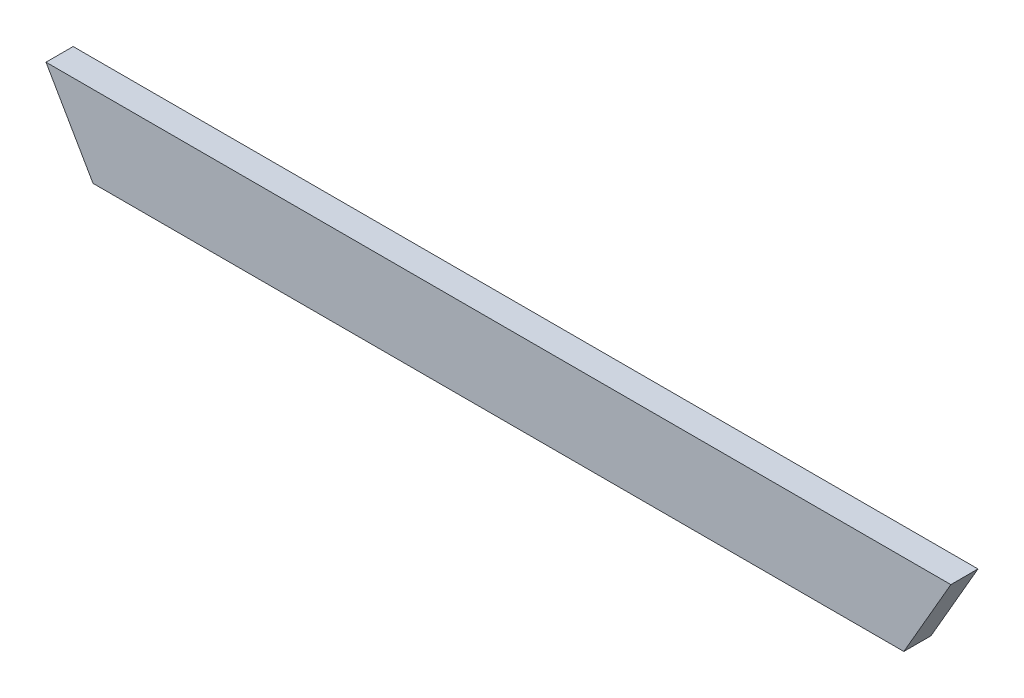
ISO-10303-21;
HEADER;
FILE_DESCRIPTION(('STEP AP214'),'2;1');
FILE_NAME('part.step','',(''),(''),'','','');
FILE_SCHEMA(('AUTOMOTIVE_DESIGN { 1 0 10303 214 1 1 1 1 }'));
ENDSEC;
DATA;
#1=APPLICATION_CONTEXT('core data for automotive mechanical design processes');
#2=APPLICATION_PROTOCOL_DEFINITION('international standard','automotive_design',2000,#1);
#3=PRODUCT_CONTEXT('',#1,'mechanical');
#4=PRODUCT('Part','Part','',(#3));
#5=PRODUCT_RELATED_PRODUCT_CATEGORY('part','',(#4));
#6=PRODUCT_DEFINITION_FORMATION('','',#4);
#7=PRODUCT_DEFINITION_CONTEXT('part definition',#1,'design');
#8=PRODUCT_DEFINITION('design','',#6,#7);
#9=PRODUCT_DEFINITION_SHAPE('','',#8);
#10=(LENGTH_UNIT() NAMED_UNIT(*) SI_UNIT(.MILLI.,.METRE.));
#11=(NAMED_UNIT(*) PLANE_ANGLE_UNIT() SI_UNIT($,.RADIAN.));
#12=(NAMED_UNIT(*) SI_UNIT($,.STERADIAN.) SOLID_ANGLE_UNIT());
#13=UNCERTAINTY_MEASURE_WITH_UNIT(LENGTH_MEASURE(1.E-05),#10,'distance_accuracy_value','');
#14=(GEOMETRIC_REPRESENTATION_CONTEXT(3) GLOBAL_UNCERTAINTY_ASSIGNED_CONTEXT((#13)) GLOBAL_UNIT_ASSIGNED_CONTEXT((#10,
#11,#12)) REPRESENTATION_CONTEXT('',''));
#15=CARTESIAN_POINT('',(0.,0.,0.));
#16=DIRECTION('',(0.,0.,1.));
#17=DIRECTION('',(1.,0.,0.));
#18=AXIS2_PLACEMENT_3D('',#15,#16,#17);
#19=CARTESIAN_POINT('',(-199.02232370725,39.1095985267382,15.));
#20=DIRECTION('',(0.866025403784439,0.499999999999999,0.));
#21=DIRECTION('',(-0.499999999999999,0.866025403784439,0.));
#22=AXIS2_PLACEMENT_3D('',#19,#20,#21);
#23=PLANE('',#22);
#24=DIRECTION('',(0.499999999999999,-0.86602540378444,0.));
#25=VECTOR('',#24,1.);
#26=CARTESIAN_POINT('',(-199.02232370725,39.1095985267382,0.));
#27=LINE('',#26,#25);
#28=CARTESIAN_POINT('',(-225.003085820783,84.1095985267383,0.));
#29=VERTEX_POINT('',#28);
#30=CARTESIAN_POINT('',(-199.02232370725,39.1095985267382,0.));
#31=VERTEX_POINT('',#30);
#32=EDGE_CURVE('E96',#29,#31,#27,.T.);
#33=ORIENTED_EDGE('',*,*,#32,.T.);
#34=DIRECTION('',(0.,0.,-1.));
#35=VECTOR('',#34,1.);
#36=CARTESIAN_POINT('',(-199.02232370725,39.1095985267382,15.));
#37=LINE('',#36,#35);
#38=CARTESIAN_POINT('',(-199.02232370725,39.1095985267382,15.));
#39=VERTEX_POINT('',#38);
#40=EDGE_CURVE('E11',#39,#31,#37,.T.);
#41=ORIENTED_EDGE('',*,*,#40,.F.);
#42=DIRECTION('',(0.499999999999999,-0.86602540378444,0.));
#43=VECTOR('',#42,1.);
#44=CARTESIAN_POINT('',(-199.02232370725,39.1095985267382,15.));
#45=LINE('',#44,#43);
#46=CARTESIAN_POINT('',(-225.003085820783,84.1095985267383,15.));
#47=VERTEX_POINT('',#46);
#48=EDGE_CURVE('E84',#47,#39,#45,.T.);
#49=ORIENTED_EDGE('',*,*,#48,.F.);
#50=DIRECTION('',(0.,0.,-1.));
#51=VECTOR('',#50,1.);
#52=CARTESIAN_POINT('',(-225.003085820783,84.1095985267383,15.));
#53=LINE('',#52,#51);
#54=EDGE_CURVE('E92',#47,#29,#53,.T.);
#55=ORIENTED_EDGE('',*,*,#54,.T.);
#56=EDGE_LOOP('',(#33,#41,#49,#55));
#57=FACE_BOUND('',#56,.T.);
#58=ADVANCED_FACE('F33',(#57),#23,.F.);
#59=CARTESIAN_POINT('',(249.016152065684,39.1095985267383,15.));
#60=DIRECTION('',(0.,1.,0.));
#61=DIRECTION('',(-1.,0.,0.));
#62=AXIS2_PLACEMENT_3D('',#59,#60,#61);
#63=PLANE('',#62);
#64=DIRECTION('',(1.,0.,0.));
#65=VECTOR('',#64,1.);
#66=CARTESIAN_POINT('',(249.016152065684,39.1095985267383,0.));
#67=LINE('',#66,#65);
#68=CARTESIAN_POINT('',(249.016152065684,39.1095985267383,0.));
#69=VERTEX_POINT('',#68);
#70=EDGE_CURVE('E88',#31,#69,#67,.T.);
#71=ORIENTED_EDGE('',*,*,#70,.T.);
#72=DIRECTION('',(0.,0.,-1.));
#73=VECTOR('',#72,1.);
#74=CARTESIAN_POINT('',(249.016152065684,39.1095985267383,15.));
#75=LINE('',#74,#73);
#76=CARTESIAN_POINT('',(249.016152065684,39.1095985267383,15.));
#77=VERTEX_POINT('',#76);
#78=EDGE_CURVE('E41',#77,#69,#75,.T.);
#79=ORIENTED_EDGE('',*,*,#78,.F.);
#80=DIRECTION('',(1.,0.,0.));
#81=VECTOR('',#80,1.);
#82=CARTESIAN_POINT('',(249.016152065684,39.1095985267383,15.));
#83=LINE('',#82,#81);
#84=EDGE_CURVE('E79',#39,#77,#83,.T.);
#85=ORIENTED_EDGE('',*,*,#84,.F.);
#86=ORIENTED_EDGE('',*,*,#40,.T.);
#87=EDGE_LOOP('',(#71,#79,#85,#86));
#88=FACE_BOUND('',#87,.T.);
#89=ADVANCED_FACE('F87',(#88),#63,.F.);
#90=CARTESIAN_POINT('',(274.996914179217,84.1095985267383,15.));
#91=DIRECTION('',(-0.866025403784438,0.5,0.));
#92=DIRECTION('',(-0.5,-0.866025403784439,0.));
#93=AXIS2_PLACEMENT_3D('',#90,#91,#92);
#94=PLANE('',#93);
#95=DIRECTION('',(0.5,0.866025403784438,0.));
#96=VECTOR('',#95,1.);
#97=CARTESIAN_POINT('',(274.996914179217,84.1095985267383,0.));
#98=LINE('',#97,#96);
#99=CARTESIAN_POINT('',(274.996914179217,84.1095985267383,0.));
#100=VERTEX_POINT('',#99);
#101=EDGE_CURVE('E66',#69,#100,#98,.T.);
#102=ORIENTED_EDGE('',*,*,#101,.T.);
#103=DIRECTION('',(0.,0.,-1.));
#104=VECTOR('',#103,1.);
#105=CARTESIAN_POINT('',(274.996914179217,84.1095985267383,15.));
#106=LINE('',#105,#104);
#107=CARTESIAN_POINT('',(274.996914179217,84.1095985267383,15.));
#108=VERTEX_POINT('',#107);
#109=EDGE_CURVE('E89',#108,#100,#106,.T.);
#110=ORIENTED_EDGE('',*,*,#109,.F.);
#111=DIRECTION('',(0.5,0.866025403784438,0.));
#112=VECTOR('',#111,1.);
#113=CARTESIAN_POINT('',(274.996914179217,84.1095985267383,15.));
#114=LINE('',#113,#112);
#115=EDGE_CURVE('E82',#77,#108,#114,.T.);
#116=ORIENTED_EDGE('',*,*,#115,.F.);
#117=ORIENTED_EDGE('',*,*,#78,.T.);
#118=EDGE_LOOP('',(#102,#110,#116,#117));
#119=FACE_BOUND('',#118,.T.);
#120=ADVANCED_FACE('F90',(#119),#94,.F.);
#121=CARTESIAN_POINT('',(-225.003085820783,84.1095985267383,15.));
#122=DIRECTION('',(0.,-1.,0.));
#123=DIRECTION('',(1.,0.,0.));
#124=AXIS2_PLACEMENT_3D('',#121,#122,#123);
#125=PLANE('',#124);
#126=DIRECTION('',(-1.,0.,0.));
#127=VECTOR('',#126,1.);
#128=CARTESIAN_POINT('',(-225.003085820783,84.1095985267383,0.));
#129=LINE('',#128,#127);
#130=EDGE_CURVE('E72',#100,#29,#129,.T.);
#131=ORIENTED_EDGE('',*,*,#130,.T.);
#132=ORIENTED_EDGE('',*,*,#54,.F.);
#133=DIRECTION('',(-1.,0.,0.));
#134=VECTOR('',#133,1.);
#135=CARTESIAN_POINT('',(-225.003085820783,84.1095985267383,15.));
#136=LINE('',#135,#134);
#137=EDGE_CURVE('E49',#108,#47,#136,.T.);
#138=ORIENTED_EDGE('',*,*,#137,.F.);
#139=ORIENTED_EDGE('',*,*,#109,.T.);
#140=EDGE_LOOP('',(#131,#132,#138,#139));
#141=FACE_BOUND('',#140,.T.);
#142=ADVANCED_FACE('F103',(#141),#125,.F.);
#143=CARTESIAN_POINT('',(0.,0.,15.));
#144=DIRECTION('',(0.,0.,-1.));
#145=DIRECTION('',(-1.,0.,0.));
#146=AXIS2_PLACEMENT_3D('',#143,#144,#145);
#147=PLANE('',#146);
#148=ORIENTED_EDGE('',*,*,#48,.T.);
#149=ORIENTED_EDGE('',*,*,#84,.T.);
#150=ORIENTED_EDGE('',*,*,#115,.T.);
#151=ORIENTED_EDGE('',*,*,#137,.T.);
#152=EDGE_LOOP('',(#148,#149,#150,#151));
#153=FACE_BOUND('',#152,.T.);
#154=ADVANCED_FACE('F80',(#153),#147,.F.);
#155=CARTESIAN_POINT('',(0.,0.,0.));
#156=DIRECTION('',(0.,0.,-1.));
#157=DIRECTION('',(-1.,0.,0.));
#158=AXIS2_PLACEMENT_3D('',#155,#156,#157);
#159=PLANE('',#158);
#160=ORIENTED_EDGE('',*,*,#32,.F.);
#161=ORIENTED_EDGE('',*,*,#130,.F.);
#162=ORIENTED_EDGE('',*,*,#101,.F.);
#163=ORIENTED_EDGE('',*,*,#70,.F.);
#164=EDGE_LOOP('',(#160,#161,#162,#163));
#165=FACE_BOUND('',#164,.T.);
#166=ADVANCED_FACE('F106',(#165),#159,.T.);
#167=CLOSED_SHELL('',(#58,#89,#120,#142,#154,#166));
#168=MANIFOLD_SOLID_BREP('B2',#167);
#169=ADVANCED_BREP_SHAPE_REPRESENTATION('',(#18,#168),#14);
#170=SHAPE_DEFINITION_REPRESENTATION(#9,#169);
ENDSEC;
END-ISO-10303-21;
